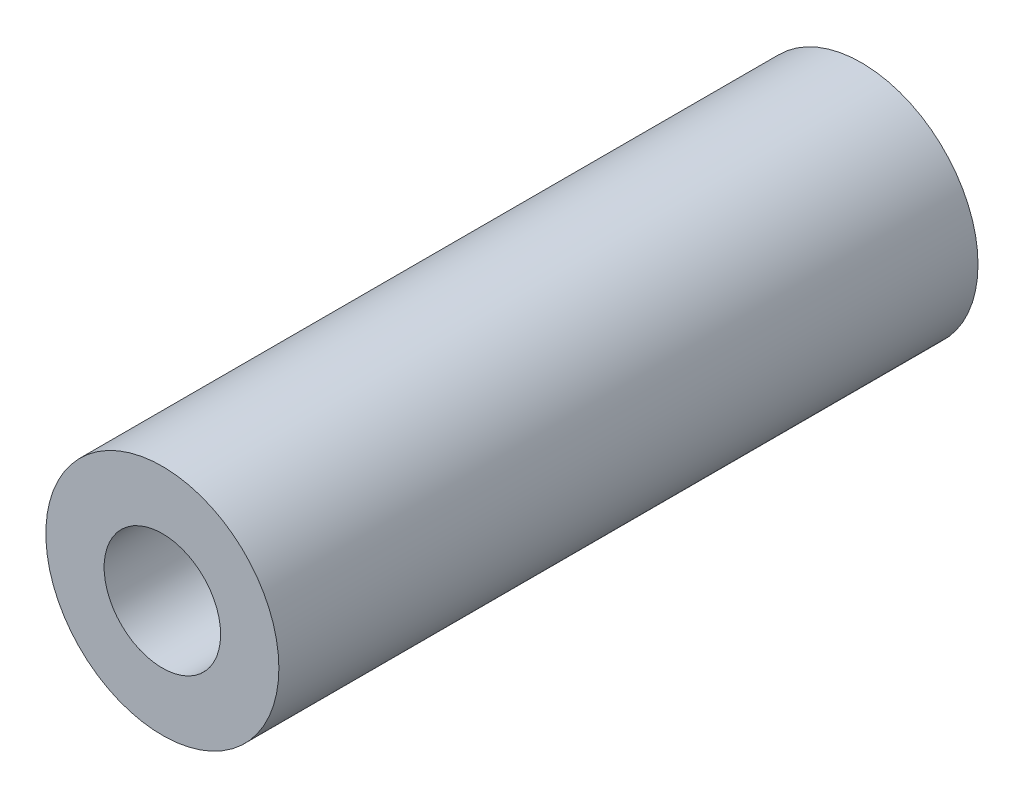
ISO-10303-21;
HEADER;
FILE_DESCRIPTION(('STEP AP214'),'2;1');
FILE_NAME('part.step','',(''),(''),'','','');
FILE_SCHEMA(('AUTOMOTIVE_DESIGN { 1 0 10303 214 1 1 1 1 }'));
ENDSEC;
DATA;
#1=APPLICATION_CONTEXT('core data for automotive mechanical design processes');
#2=APPLICATION_PROTOCOL_DEFINITION('international standard','automotive_design',2000,#1);
#3=PRODUCT_CONTEXT('',#1,'mechanical');
#4=PRODUCT('Part','Part','',(#3));
#5=PRODUCT_RELATED_PRODUCT_CATEGORY('part','',(#4));
#6=PRODUCT_DEFINITION_FORMATION('','',#4);
#7=PRODUCT_DEFINITION_CONTEXT('part definition',#1,'design');
#8=PRODUCT_DEFINITION('design','',#6,#7);
#9=PRODUCT_DEFINITION_SHAPE('','',#8);
#10=(LENGTH_UNIT() NAMED_UNIT(*) SI_UNIT(.MILLI.,.METRE.));
#11=(NAMED_UNIT(*) PLANE_ANGLE_UNIT() SI_UNIT($,.RADIAN.));
#12=(NAMED_UNIT(*) SI_UNIT($,.STERADIAN.) SOLID_ANGLE_UNIT());
#13=UNCERTAINTY_MEASURE_WITH_UNIT(LENGTH_MEASURE(1.E-05),#10,'distance_accuracy_value','');
#14=(GEOMETRIC_REPRESENTATION_CONTEXT(3) GLOBAL_UNCERTAINTY_ASSIGNED_CONTEXT((#13)) GLOBAL_UNIT_ASSIGNED_CONTEXT((#10,
#11,#12)) REPRESENTATION_CONTEXT('',''));
#15=CARTESIAN_POINT('',(0.,0.,0.));
#16=DIRECTION('',(0.,0.,1.));
#17=DIRECTION('',(1.,0.,0.));
#18=AXIS2_PLACEMENT_3D('',#15,#16,#17);
#19=CARTESIAN_POINT('',(0.,0.,150.));
#20=DIRECTION('',(0.,0.,-1.));
#21=DIRECTION('',(-1.,0.,0.));
#22=AXIS2_PLACEMENT_3D('',#19,#20,#21);
#23=CYLINDRICAL_SURFACE('',#22,25.);
#24=CARTESIAN_POINT('',(0.,0.,150.));
#25=DIRECTION('',(0.,0.,1.));
#26=DIRECTION('',(1.,0.,0.));
#27=AXIS2_PLACEMENT_3D('',#24,#25,#26);
#28=CIRCLE('',#27,25.);
#29=CARTESIAN_POINT('',(25.,0.,150.));
#30=VERTEX_POINT('',#29);
#31=EDGE_CURVE('E10',#30,#30,#28,.T.);
#32=ORIENTED_EDGE('',*,*,#31,.F.);
#33=EDGE_LOOP('',(#32));
#34=FACE_BOUND('',#33,.T.);
#35=CARTESIAN_POINT('',(0.,0.,0.));
#36=DIRECTION('',(0.,0.,1.));
#37=DIRECTION('',(1.,0.,0.));
#38=AXIS2_PLACEMENT_3D('',#35,#36,#37);
#39=CIRCLE('',#38,25.);
#40=CARTESIAN_POINT('',(25.,0.,0.));
#41=VERTEX_POINT('',#40);
#42=EDGE_CURVE('E34',#41,#41,#39,.T.);
#43=ORIENTED_EDGE('',*,*,#42,.T.);
#44=EDGE_LOOP('',(#43));
#45=FACE_BOUND('',#44,.T.);
#46=ADVANCED_FACE('F31',(#34,#45),#23,.T.);
#47=CARTESIAN_POINT('',(0.,0.,150.));
#48=DIRECTION('',(0.,0.,1.));
#49=DIRECTION('',(1.,0.,0.));
#50=AXIS2_PLACEMENT_3D('',#47,#48,#49);
#51=PLANE('',#50);
#52=CARTESIAN_POINT('',(0.,0.,150.));
#53=DIRECTION('',(0.,0.,1.));
#54=DIRECTION('',(1.,0.,0.));
#55=AXIS2_PLACEMENT_3D('',#52,#53,#54);
#56=CIRCLE('',#55,12.5);
#57=CARTESIAN_POINT('',(12.5,0.,150.));
#58=VERTEX_POINT('',#57);
#59=EDGE_CURVE('E43',#58,#58,#56,.T.);
#60=ORIENTED_EDGE('',*,*,#59,.F.);
#61=EDGE_LOOP('',(#60));
#62=FACE_BOUND('',#61,.T.);
#63=ORIENTED_EDGE('',*,*,#31,.T.);
#64=EDGE_LOOP('',(#63));
#65=FACE_BOUND('',#64,.T.);
#66=ADVANCED_FACE('F58',(#62,#65),#51,.T.);
#67=CARTESIAN_POINT('',(0.,0.,0.));
#68=DIRECTION('',(0.,0.,1.));
#69=DIRECTION('',(1.,0.,0.));
#70=AXIS2_PLACEMENT_3D('',#67,#68,#69);
#71=PLANE('',#70);
#72=ORIENTED_EDGE('',*,*,#42,.F.);
#73=EDGE_LOOP('',(#72));
#74=FACE_BOUND('',#73,.T.);
#75=ADVANCED_FACE('F54',(#74),#71,.F.);
#76=CARTESIAN_POINT('',(0.,0.,50.));
#77=DIRECTION('',(0.,0.,1.));
#78=DIRECTION('',(1.,0.,0.));
#79=AXIS2_PLACEMENT_3D('',#76,#77,#78);
#80=CYLINDRICAL_SURFACE('',#79,12.5);
#81=CARTESIAN_POINT('',(0.,0.,50.));
#82=DIRECTION('',(0.,0.,1.));
#83=DIRECTION('',(1.,0.,0.));
#84=AXIS2_PLACEMENT_3D('',#81,#82,#83);
#85=CIRCLE('',#84,12.5);
#86=CARTESIAN_POINT('',(12.5,0.,50.));
#87=VERTEX_POINT('',#86);
#88=EDGE_CURVE('E41',#87,#87,#85,.T.);
#89=ORIENTED_EDGE('',*,*,#88,.F.);
#90=EDGE_LOOP('',(#89));
#91=FACE_BOUND('',#90,.T.);
#92=ORIENTED_EDGE('',*,*,#59,.T.);
#93=EDGE_LOOP('',(#92));
#94=FACE_BOUND('',#93,.T.);
#95=ADVANCED_FACE('F51',(#91,#94),#80,.F.);
#96=CARTESIAN_POINT('',(0.,0.,50.));
#97=DIRECTION('',(0.,0.,1.));
#98=DIRECTION('',(1.,0.,0.));
#99=AXIS2_PLACEMENT_3D('',#96,#97,#98);
#100=PLANE('',#99);
#101=ORIENTED_EDGE('',*,*,#88,.T.);
#102=EDGE_LOOP('',(#101));
#103=FACE_BOUND('',#102,.T.);
#104=ADVANCED_FACE('F49',(#103),#100,.T.);
#105=CLOSED_SHELL('',(#46,#66,#75,#95,#104));
#106=MANIFOLD_SOLID_BREP('B2',#105);
#107=ADVANCED_BREP_SHAPE_REPRESENTATION('',(#18,#106),#14);
#108=SHAPE_DEFINITION_REPRESENTATION(#9,#107);
ENDSEC;
END-ISO-10303-21;
